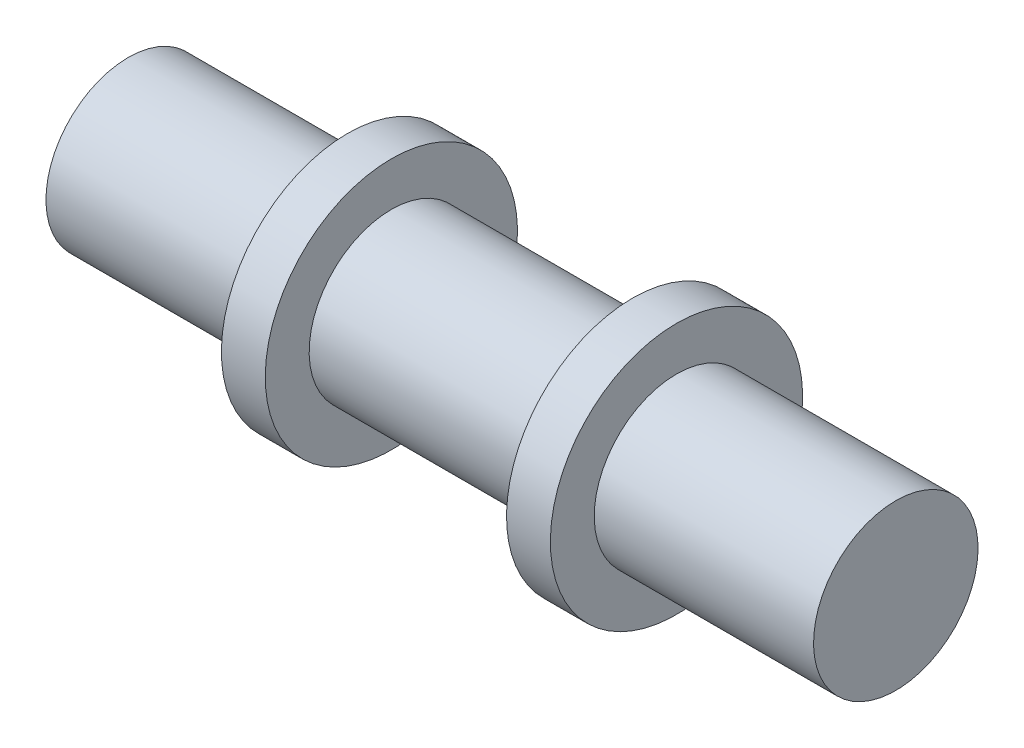
ISO-10303-21;
HEADER;
FILE_DESCRIPTION(('STEP AP214'),'2;1');
FILE_NAME('part.step','',(''),(''),'','','');
FILE_SCHEMA(('AUTOMOTIVE_DESIGN { 1 0 10303 214 1 1 1 1 }'));
ENDSEC;
DATA;
#1=APPLICATION_CONTEXT('core data for automotive mechanical design processes');
#2=APPLICATION_PROTOCOL_DEFINITION('international standard','automotive_design',2000,#1);
#3=PRODUCT_CONTEXT('',#1,'mechanical');
#4=PRODUCT('Part','Part','',(#3));
#5=PRODUCT_RELATED_PRODUCT_CATEGORY('part','',(#4));
#6=PRODUCT_DEFINITION_FORMATION('','',#4);
#7=PRODUCT_DEFINITION_CONTEXT('part definition',#1,'design');
#8=PRODUCT_DEFINITION('design','',#6,#7);
#9=PRODUCT_DEFINITION_SHAPE('','',#8);
#10=(LENGTH_UNIT() NAMED_UNIT(*) SI_UNIT(.MILLI.,.METRE.));
#11=(NAMED_UNIT(*) PLANE_ANGLE_UNIT() SI_UNIT($,.RADIAN.));
#12=(NAMED_UNIT(*) SI_UNIT($,.STERADIAN.) SOLID_ANGLE_UNIT());
#13=UNCERTAINTY_MEASURE_WITH_UNIT(LENGTH_MEASURE(1.E-05),#10,'distance_accuracy_value','');
#14=(GEOMETRIC_REPRESENTATION_CONTEXT(3) GLOBAL_UNCERTAINTY_ASSIGNED_CONTEXT((#13)) GLOBAL_UNIT_ASSIGNED_CONTEXT((#10,
#11,#12)) REPRESENTATION_CONTEXT('',''));
#15=CARTESIAN_POINT('',(0.,0.,0.));
#16=DIRECTION('',(0.,0.,1.));
#17=DIRECTION('',(1.,0.,0.));
#18=AXIS2_PLACEMENT_3D('',#15,#16,#17);
#19=CARTESIAN_POINT('',(-88.9,0.,0.));
#20=DIRECTION('',(-1.,0.,0.));
#21=DIRECTION('',(0.,-1.,0.));
#22=AXIS2_PLACEMENT_3D('',#19,#20,#21);
#23=PLANE('',#22);
#24=CARTESIAN_POINT('',(-88.9,0.,0.));
#25=DIRECTION('',(1.,0.,0.));
#26=DIRECTION('',(0.,1.,0.));
#27=AXIS2_PLACEMENT_3D('',#24,#25,#26);
#28=CIRCLE('',#27,19.05);
#29=CARTESIAN_POINT('',(-88.9,19.05,0.));
#30=VERTEX_POINT('',#29);
#31=EDGE_CURVE('E10',#30,#30,#28,.T.);
#32=ORIENTED_EDGE('',*,*,#31,.F.);
#33=EDGE_LOOP('',(#32));
#34=FACE_BOUND('',#33,.T.);
#35=ADVANCED_FACE('F35',(#34),#23,.T.);
#36=CARTESIAN_POINT('',(88.9,0.,0.));
#37=DIRECTION('',(1.,0.,0.));
#38=DIRECTION('',(0.,1.,0.));
#39=AXIS2_PLACEMENT_3D('',#36,#37,#38);
#40=CYLINDRICAL_SURFACE('',#39,19.05);
#41=ORIENTED_EDGE('',*,*,#31,.T.);
#42=EDGE_LOOP('',(#41));
#43=FACE_BOUND('',#42,.T.);
#44=CARTESIAN_POINT('',(-38.1,0.,0.));
#45=DIRECTION('',(1.,0.,0.));
#46=DIRECTION('',(0.,1.,0.));
#47=AXIS2_PLACEMENT_3D('',#44,#45,#46);
#48=CIRCLE('',#47,19.05);
#49=CARTESIAN_POINT('',(-38.1,19.05,0.));
#50=VERTEX_POINT('',#49);
#51=EDGE_CURVE('E42',#50,#50,#48,.T.);
#52=ORIENTED_EDGE('',*,*,#51,.F.);
#53=EDGE_LOOP('',(#52));
#54=FACE_BOUND('',#53,.T.);
#55=ADVANCED_FACE('F99',(#43,#54),#40,.T.);
#56=CARTESIAN_POINT('',(-38.1,19.05,0.));
#57=DIRECTION('',(-1.,0.,0.));
#58=DIRECTION('',(0.,-1.,0.));
#59=AXIS2_PLACEMENT_3D('',#56,#57,#58);
#60=PLANE('',#59);
#61=ORIENTED_EDGE('',*,*,#51,.T.);
#62=EDGE_LOOP('',(#61));
#63=FACE_BOUND('',#62,.T.);
#64=CARTESIAN_POINT('',(-38.1,0.,0.));
#65=DIRECTION('',(1.,0.,0.));
#66=DIRECTION('',(0.,1.,0.));
#67=AXIS2_PLACEMENT_3D('',#64,#65,#66);
#68=CIRCLE('',#67,29.21);
#69=CARTESIAN_POINT('',(-38.1,29.21,0.));
#70=VERTEX_POINT('',#69);
#71=EDGE_CURVE('E47',#70,#70,#68,.T.);
#72=ORIENTED_EDGE('',*,*,#71,.F.);
#73=EDGE_LOOP('',(#72));
#74=FACE_BOUND('',#73,.T.);
#75=ADVANCED_FACE('F104',(#63,#74),#60,.T.);
#76=CARTESIAN_POINT('',(88.9,0.,0.));
#77=DIRECTION('',(1.,0.,0.));
#78=DIRECTION('',(0.,1.,0.));
#79=AXIS2_PLACEMENT_3D('',#76,#77,#78);
#80=CYLINDRICAL_SURFACE('',#79,29.21);
#81=ORIENTED_EDGE('',*,*,#71,.T.);
#82=EDGE_LOOP('',(#81));
#83=FACE_BOUND('',#82,.T.);
#84=CARTESIAN_POINT('',(-27.94,0.,0.));
#85=DIRECTION('',(1.,0.,0.));
#86=DIRECTION('',(0.,1.,0.));
#87=AXIS2_PLACEMENT_3D('',#84,#85,#86);
#88=CIRCLE('',#87,29.21);
#89=CARTESIAN_POINT('',(-27.94,29.21,0.));
#90=VERTEX_POINT('',#89);
#91=EDGE_CURVE('E52',#90,#90,#88,.T.);
#92=ORIENTED_EDGE('',*,*,#91,.F.);
#93=EDGE_LOOP('',(#92));
#94=FACE_BOUND('',#93,.T.);
#95=ADVANCED_FACE('F108',(#83,#94),#80,.T.);
#96=CARTESIAN_POINT('',(-27.94,29.21,0.));
#97=DIRECTION('',(1.,0.,0.));
#98=DIRECTION('',(0.,1.,0.));
#99=AXIS2_PLACEMENT_3D('',#96,#97,#98);
#100=PLANE('',#99);
#101=ORIENTED_EDGE('',*,*,#91,.T.);
#102=EDGE_LOOP('',(#101));
#103=FACE_BOUND('',#102,.T.);
#104=CARTESIAN_POINT('',(-27.94,0.,0.));
#105=DIRECTION('',(1.,0.,0.));
#106=DIRECTION('',(0.,1.,0.));
#107=AXIS2_PLACEMENT_3D('',#104,#105,#106);
#108=CIRCLE('',#107,19.05);
#109=CARTESIAN_POINT('',(-27.94,19.05,0.));
#110=VERTEX_POINT('',#109);
#111=EDGE_CURVE('E58',#110,#110,#108,.T.);
#112=ORIENTED_EDGE('',*,*,#111,.F.);
#113=EDGE_LOOP('',(#112));
#114=FACE_BOUND('',#113,.T.);
#115=ADVANCED_FACE('F114',(#103,#114),#100,.T.);
#116=CARTESIAN_POINT('',(88.9,0.,0.));
#117=DIRECTION('',(1.,0.,0.));
#118=DIRECTION('',(0.,1.,0.));
#119=AXIS2_PLACEMENT_3D('',#116,#117,#118);
#120=CYLINDRICAL_SURFACE('',#119,19.05);
#121=ORIENTED_EDGE('',*,*,#111,.T.);
#122=EDGE_LOOP('',(#121));
#123=FACE_BOUND('',#122,.T.);
#124=CARTESIAN_POINT('',(27.94,0.,0.));
#125=DIRECTION('',(1.,0.,0.));
#126=DIRECTION('',(0.,1.,0.));
#127=AXIS2_PLACEMENT_3D('',#124,#125,#126);
#128=CIRCLE('',#127,19.05);
#129=CARTESIAN_POINT('',(27.94,19.05,0.));
#130=VERTEX_POINT('',#129);
#131=EDGE_CURVE('E62',#130,#130,#128,.T.);
#132=ORIENTED_EDGE('',*,*,#131,.F.);
#133=EDGE_LOOP('',(#132));
#134=FACE_BOUND('',#133,.T.);
#135=ADVANCED_FACE('F118',(#123,#134),#120,.T.);
#136=CARTESIAN_POINT('',(27.94,29.21,0.));
#137=DIRECTION('',(-1.,0.,0.));
#138=DIRECTION('',(0.,-1.,0.));
#139=AXIS2_PLACEMENT_3D('',#136,#137,#138);
#140=PLANE('',#139);
#141=ORIENTED_EDGE('',*,*,#131,.T.);
#142=EDGE_LOOP('',(#141));
#143=FACE_BOUND('',#142,.T.);
#144=CARTESIAN_POINT('',(27.94,0.,0.));
#145=DIRECTION('',(1.,0.,0.));
#146=DIRECTION('',(0.,1.,0.));
#147=AXIS2_PLACEMENT_3D('',#144,#145,#146);
#148=CIRCLE('',#147,29.21);
#149=CARTESIAN_POINT('',(27.94,29.21,0.));
#150=VERTEX_POINT('',#149);
#151=EDGE_CURVE('E66',#150,#150,#148,.T.);
#152=ORIENTED_EDGE('',*,*,#151,.F.);
#153=EDGE_LOOP('',(#152));
#154=FACE_BOUND('',#153,.T.);
#155=ADVANCED_FACE('F122',(#143,#154),#140,.T.);
#156=CARTESIAN_POINT('',(88.9,0.,0.));
#157=DIRECTION('',(1.,0.,0.));
#158=DIRECTION('',(0.,1.,0.));
#159=AXIS2_PLACEMENT_3D('',#156,#157,#158);
#160=CYLINDRICAL_SURFACE('',#159,29.21);
#161=ORIENTED_EDGE('',*,*,#151,.T.);
#162=EDGE_LOOP('',(#161));
#163=FACE_BOUND('',#162,.T.);
#164=CARTESIAN_POINT('',(38.1,0.,0.));
#165=DIRECTION('',(1.,0.,0.));
#166=DIRECTION('',(0.,1.,0.));
#167=AXIS2_PLACEMENT_3D('',#164,#165,#166);
#168=CIRCLE('',#167,29.21);
#169=CARTESIAN_POINT('',(38.1,29.21,0.));
#170=VERTEX_POINT('',#169);
#171=EDGE_CURVE('E70',#170,#170,#168,.T.);
#172=ORIENTED_EDGE('',*,*,#171,.F.);
#173=EDGE_LOOP('',(#172));
#174=FACE_BOUND('',#173,.T.);
#175=ADVANCED_FACE('F95',(#163,#174),#160,.T.);
#176=CARTESIAN_POINT('',(38.1,19.05,0.));
#177=DIRECTION('',(1.,0.,0.));
#178=DIRECTION('',(0.,1.,0.));
#179=AXIS2_PLACEMENT_3D('',#176,#177,#178);
#180=PLANE('',#179);
#181=ORIENTED_EDGE('',*,*,#171,.T.);
#182=EDGE_LOOP('',(#181));
#183=FACE_BOUND('',#182,.T.);
#184=CARTESIAN_POINT('',(38.1,0.,0.));
#185=DIRECTION('',(1.,0.,0.));
#186=DIRECTION('',(0.,1.,0.));
#187=AXIS2_PLACEMENT_3D('',#184,#185,#186);
#188=CIRCLE('',#187,19.05);
#189=CARTESIAN_POINT('',(38.1,19.05,0.));
#190=VERTEX_POINT('',#189);
#191=EDGE_CURVE('E74',#190,#190,#188,.T.);
#192=ORIENTED_EDGE('',*,*,#191,.F.);
#193=EDGE_LOOP('',(#192));
#194=FACE_BOUND('',#193,.T.);
#195=ADVANCED_FACE('F87',(#183,#194),#180,.T.);
#196=CARTESIAN_POINT('',(88.9,0.,0.));
#197=DIRECTION('',(1.,0.,0.));
#198=DIRECTION('',(0.,1.,0.));
#199=AXIS2_PLACEMENT_3D('',#196,#197,#198);
#200=CYLINDRICAL_SURFACE('',#199,19.05);
#201=ORIENTED_EDGE('',*,*,#191,.T.);
#202=EDGE_LOOP('',(#201));
#203=FACE_BOUND('',#202,.T.);
#204=CARTESIAN_POINT('',(88.9,0.,0.));
#205=DIRECTION('',(1.,0.,0.));
#206=DIRECTION('',(0.,1.,0.));
#207=AXIS2_PLACEMENT_3D('',#204,#205,#206);
#208=CIRCLE('',#207,19.05);
#209=CARTESIAN_POINT('',(88.9,19.05,0.));
#210=VERTEX_POINT('',#209);
#211=EDGE_CURVE('E78',#210,#210,#208,.T.);
#212=ORIENTED_EDGE('',*,*,#211,.F.);
#213=EDGE_LOOP('',(#212));
#214=FACE_BOUND('',#213,.T.);
#215=ADVANCED_FACE('F85',(#203,#214),#200,.T.);
#216=CARTESIAN_POINT('',(88.9,0.,0.));
#217=DIRECTION('',(1.,0.,0.));
#218=DIRECTION('',(0.,1.,0.));
#219=AXIS2_PLACEMENT_3D('',#216,#217,#218);
#220=PLANE('',#219);
#221=ORIENTED_EDGE('',*,*,#211,.T.);
#222=EDGE_LOOP('',(#221));
#223=FACE_BOUND('',#222,.T.);
#224=ADVANCED_FACE('F83',(#223),#220,.T.);
#225=CLOSED_SHELL('',(#35,#55,#75,#95,#115,#135,#155,#175,#195,#215,#224));
#226=MANIFOLD_SOLID_BREP('B2',#225);
#227=ADVANCED_BREP_SHAPE_REPRESENTATION('',(#18,#226),#14);
#228=SHAPE_DEFINITION_REPRESENTATION(#9,#227);
ENDSEC;
END-ISO-10303-21;
